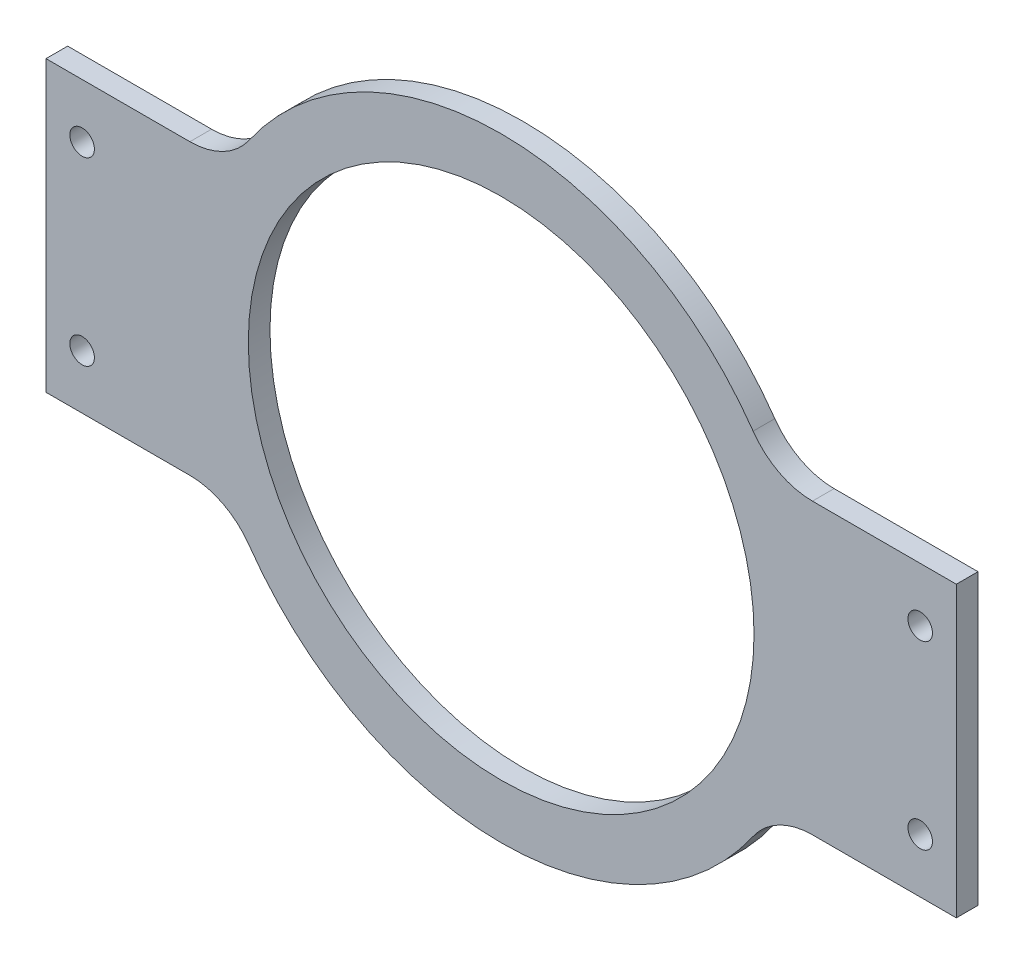
ISO-10303-21;
HEADER;
FILE_DESCRIPTION(('STEP AP214'),'2;1');
FILE_NAME('part.step','',(''),(''),'','','');
FILE_SCHEMA(('AUTOMOTIVE_DESIGN { 1 0 10303 214 1 1 1 1 }'));
ENDSEC;
DATA;
#1=APPLICATION_CONTEXT('core data for automotive mechanical design processes');
#2=APPLICATION_PROTOCOL_DEFINITION('international standard','automotive_design',2000,#1);
#3=PRODUCT_CONTEXT('',#1,'mechanical');
#4=PRODUCT('Part','Part','',(#3));
#5=PRODUCT_RELATED_PRODUCT_CATEGORY('part','',(#4));
#6=PRODUCT_DEFINITION_FORMATION('','',#4);
#7=PRODUCT_DEFINITION_CONTEXT('part definition',#1,'design');
#8=PRODUCT_DEFINITION('design','',#6,#7);
#9=PRODUCT_DEFINITION_SHAPE('','',#8);
#10=(LENGTH_UNIT() NAMED_UNIT(*) SI_UNIT(.MILLI.,.METRE.));
#11=(NAMED_UNIT(*) PLANE_ANGLE_UNIT() SI_UNIT($,.RADIAN.));
#12=(NAMED_UNIT(*) SI_UNIT($,.STERADIAN.) SOLID_ANGLE_UNIT());
#13=UNCERTAINTY_MEASURE_WITH_UNIT(LENGTH_MEASURE(1.E-05),#10,'distance_accuracy_value','');
#14=(GEOMETRIC_REPRESENTATION_CONTEXT(3) GLOBAL_UNCERTAINTY_ASSIGNED_CONTEXT((#13)) GLOBAL_UNIT_ASSIGNED_CONTEXT((#10,
#11,#12)) REPRESENTATION_CONTEXT('',''));
#15=CARTESIAN_POINT('',(0.,0.,0.));
#16=DIRECTION('',(0.,0.,1.));
#17=DIRECTION('',(1.,0.,0.));
#18=AXIS2_PLACEMENT_3D('',#15,#16,#17);
#19=CARTESIAN_POINT('',(0.,0.,1.5));
#20=DIRECTION('',(0.,0.,1.));
#21=DIRECTION('',(1.,0.,0.));
#22=AXIS2_PLACEMENT_3D('',#19,#20,#21);
#23=PLANE('',#22);
#24=CARTESIAN_POINT('',(58.,12.5,1.5));
#25=DIRECTION('',(0.,0.,1.));
#26=DIRECTION('',(1.,0.,0.));
#27=AXIS2_PLACEMENT_3D('',#24,#25,#26);
#28=CIRCLE('',#27,1.69999999999999);
#29=CARTESIAN_POINT('',(59.7,12.5,1.5));
#30=VERTEX_POINT('',#29);
#31=EDGE_CURVE('E326',#30,#30,#28,.T.);
#32=ORIENTED_EDGE('',*,*,#31,.F.);
#33=EDGE_LOOP('',(#32));
#34=FACE_BOUND('',#33,.T.);
#35=CARTESIAN_POINT('',(58.,-12.5,1.5));
#36=DIRECTION('',(0.,0.,1.));
#37=DIRECTION('',(1.,0.,0.));
#38=AXIS2_PLACEMENT_3D('',#35,#36,#37);
#39=CIRCLE('',#38,1.69999999999999);
#40=CARTESIAN_POINT('',(59.7,-12.5,1.5));
#41=VERTEX_POINT('',#40);
#42=EDGE_CURVE('E320',#41,#41,#39,.T.);
#43=ORIENTED_EDGE('',*,*,#42,.F.);
#44=EDGE_LOOP('',(#43));
#45=FACE_BOUND('',#44,.T.);
#46=CARTESIAN_POINT('',(-58.,12.5,1.5));
#47=DIRECTION('',(0.,0.,1.));
#48=DIRECTION('',(1.,0.,0.));
#49=AXIS2_PLACEMENT_3D('',#46,#47,#48);
#50=CIRCLE('',#49,1.69999999999999);
#51=CARTESIAN_POINT('',(-56.3,12.5,1.5));
#52=VERTEX_POINT('',#51);
#53=EDGE_CURVE('E314',#52,#52,#50,.T.);
#54=ORIENTED_EDGE('',*,*,#53,.F.);
#55=EDGE_LOOP('',(#54));
#56=FACE_BOUND('',#55,.T.);
#57=CARTESIAN_POINT('',(-58.,-12.5,1.5));
#58=DIRECTION('',(0.,0.,1.));
#59=DIRECTION('',(1.,0.,0.));
#60=AXIS2_PLACEMENT_3D('',#57,#58,#59);
#61=CIRCLE('',#60,1.69999999999999);
#62=CARTESIAN_POINT('',(-56.3,-12.5,1.5));
#63=VERTEX_POINT('',#62);
#64=EDGE_CURVE('E308',#63,#63,#61,.T.);
#65=ORIENTED_EDGE('',*,*,#64,.F.);
#66=EDGE_LOOP('',(#65));
#67=FACE_BOUND('',#66,.T.);
#68=DIRECTION('',(-1.,0.,0.));
#69=VECTOR('',#68,1.);
#70=CARTESIAN_POINT('',(37.5,20.,1.5));
#71=LINE('',#70,#69);
#72=CARTESIAN_POINT('',(63.,20.,1.5));
#73=VERTEX_POINT('',#72);
#74=CARTESIAN_POINT('',(43.0842198490352,20.,1.5));
#75=VERTEX_POINT('',#74);
#76=EDGE_CURVE('E158',#73,#75,#71,.T.);
#77=ORIENTED_EDGE('',*,*,#76,.T.);
#78=CARTESIAN_POINT('',(43.0842198490352,30.,1.5));
#79=DIRECTION('',(0.,0.,1.));
#80=DIRECTION('',(1.,0.,0.));
#81=AXIS2_PLACEMENT_3D('',#78,#79,#80);
#82=CIRCLE('',#81,10.);
#83=CARTESIAN_POINT('',(34.8777017825523,24.2857142857143,1.5));
#84=VERTEX_POINT('',#83);
#85=EDGE_CURVE('E215',#75,#84,#82,.F.);
#86=ORIENTED_EDGE('',*,*,#85,.T.);
#87=CARTESIAN_POINT('',(0.,0.,1.5));
#88=DIRECTION('',(0.,0.,1.));
#89=DIRECTION('',(1.,0.,0.));
#90=AXIS2_PLACEMENT_3D('',#87,#88,#89);
#91=CIRCLE('',#90,42.5);
#92=CARTESIAN_POINT('',(-34.8777017825523,24.2857142857143,1.5));
#93=VERTEX_POINT('',#92);
#94=EDGE_CURVE('E131',#84,#93,#91,.T.);
#95=ORIENTED_EDGE('',*,*,#94,.T.);
#96=CARTESIAN_POINT('',(-43.0842198490352,30.,1.5));
#97=DIRECTION('',(0.,0.,1.));
#98=DIRECTION('',(1.,0.,0.));
#99=AXIS2_PLACEMENT_3D('',#96,#97,#98);
#100=CIRCLE('',#99,10.);
#101=CARTESIAN_POINT('',(-43.0842198490352,20.,1.5));
#102=VERTEX_POINT('',#101);
#103=EDGE_CURVE('E11',#93,#102,#100,.F.);
#104=ORIENTED_EDGE('',*,*,#103,.T.);
#105=DIRECTION('',(-1.,0.,0.));
#106=VECTOR('',#105,1.);
#107=CARTESIAN_POINT('',(-63.,20.,1.5));
#108=LINE('',#107,#106);
#109=CARTESIAN_POINT('',(-63.,20.,1.5));
#110=VERTEX_POINT('',#109);
#111=EDGE_CURVE('E122',#102,#110,#108,.T.);
#112=ORIENTED_EDGE('',*,*,#111,.T.);
#113=DIRECTION('',(0.,-1.,0.));
#114=VECTOR('',#113,1.);
#115=CARTESIAN_POINT('',(-63.,20.,1.5));
#116=LINE('',#115,#114);
#117=CARTESIAN_POINT('',(-63.,-20.,1.5));
#118=VERTEX_POINT('',#117);
#119=EDGE_CURVE('E128',#110,#118,#116,.T.);
#120=ORIENTED_EDGE('',*,*,#119,.T.);
#121=DIRECTION('',(1.,0.,0.));
#122=VECTOR('',#121,1.);
#123=CARTESIAN_POINT('',(-63.,-20.,1.5));
#124=LINE('',#123,#122);
#125=CARTESIAN_POINT('',(-43.0842198490352,-20.,1.5));
#126=VERTEX_POINT('',#125);
#127=EDGE_CURVE('E146',#118,#126,#124,.T.);
#128=ORIENTED_EDGE('',*,*,#127,.T.);
#129=CARTESIAN_POINT('',(-43.0842198490352,-30.,1.5));
#130=DIRECTION('',(0.,0.,1.));
#131=DIRECTION('',(1.,0.,0.));
#132=AXIS2_PLACEMENT_3D('',#129,#130,#131);
#133=CIRCLE('',#132,10.);
#134=CARTESIAN_POINT('',(-34.8777017825523,-24.2857142857143,1.5));
#135=VERTEX_POINT('',#134);
#136=EDGE_CURVE('E207',#126,#135,#133,.F.);
#137=ORIENTED_EDGE('',*,*,#136,.T.);
#138=CARTESIAN_POINT('',(0.,0.,1.5));
#139=DIRECTION('',(0.,0.,1.));
#140=DIRECTION('',(1.,0.,0.));
#141=AXIS2_PLACEMENT_3D('',#138,#139,#140);
#142=CIRCLE('',#141,42.5);
#143=CARTESIAN_POINT('',(34.8777017825523,-24.2857142857143,1.5));
#144=VERTEX_POINT('',#143);
#145=EDGE_CURVE('E148',#135,#144,#142,.T.);
#146=ORIENTED_EDGE('',*,*,#145,.T.);
#147=CARTESIAN_POINT('',(43.0842198490352,-30.,1.5));
#148=DIRECTION('',(0.,0.,1.));
#149=DIRECTION('',(1.,0.,0.));
#150=AXIS2_PLACEMENT_3D('',#147,#148,#149);
#151=CIRCLE('',#150,10.);
#152=CARTESIAN_POINT('',(43.0842198490352,-20.,1.5));
#153=VERTEX_POINT('',#152);
#154=EDGE_CURVE('E211',#144,#153,#151,.F.);
#155=ORIENTED_EDGE('',*,*,#154,.T.);
#156=DIRECTION('',(1.,0.,0.));
#157=VECTOR('',#156,1.);
#158=CARTESIAN_POINT('',(37.5,-20.,1.5));
#159=LINE('',#158,#157);
#160=CARTESIAN_POINT('',(63.,-20.,1.5));
#161=VERTEX_POINT('',#160);
#162=EDGE_CURVE('E154',#153,#161,#159,.T.);
#163=ORIENTED_EDGE('',*,*,#162,.T.);
#164=DIRECTION('',(0.,1.,0.));
#165=VECTOR('',#164,1.);
#166=CARTESIAN_POINT('',(63.,20.,1.5));
#167=LINE('',#166,#165);
#168=EDGE_CURVE('E156',#161,#73,#167,.T.);
#169=ORIENTED_EDGE('',*,*,#168,.T.);
#170=EDGE_LOOP('',(#77,#86,#95,#104,#112,#120,#128,#137,#146,#155,#163,#169));
#171=FACE_BOUND('',#170,.T.);
#172=CARTESIAN_POINT('',(0.,0.,1.5));
#173=DIRECTION('',(0.,0.,1.));
#174=DIRECTION('',(1.,0.,0.));
#175=AXIS2_PLACEMENT_3D('',#172,#173,#174);
#176=CIRCLE('',#175,35.);
#177=CARTESIAN_POINT('',(35.,0.,1.5));
#178=VERTEX_POINT('',#177);
#179=EDGE_CURVE('E164',#178,#178,#176,.T.);
#180=ORIENTED_EDGE('',*,*,#179,.F.);
#181=EDGE_LOOP('',(#180));
#182=FACE_BOUND('',#181,.T.);
#183=ADVANCED_FACE('F37',(#34,#45,#56,#67,#171,#182),#23,.T.);
#184=CARTESIAN_POINT('',(0.,0.,-1.5));
#185=DIRECTION('',(0.,0.,1.));
#186=DIRECTION('',(1.,0.,0.));
#187=AXIS2_PLACEMENT_3D('',#184,#185,#186);
#188=PLANE('',#187);
#189=CARTESIAN_POINT('',(58.,12.5,-1.5));
#190=DIRECTION('',(0.,0.,1.));
#191=DIRECTION('',(1.,0.,0.));
#192=AXIS2_PLACEMENT_3D('',#189,#190,#191);
#193=CIRCLE('',#192,1.7);
#194=CARTESIAN_POINT('',(59.7,12.5,-1.5));
#195=VERTEX_POINT('',#194);
#196=EDGE_CURVE('E323',#195,#195,#193,.T.);
#197=ORIENTED_EDGE('',*,*,#196,.T.);
#198=EDGE_LOOP('',(#197));
#199=FACE_BOUND('',#198,.T.);
#200=CARTESIAN_POINT('',(58.,-12.5,-1.5));
#201=DIRECTION('',(0.,0.,1.));
#202=DIRECTION('',(1.,0.,0.));
#203=AXIS2_PLACEMENT_3D('',#200,#201,#202);
#204=CIRCLE('',#203,1.7);
#205=CARTESIAN_POINT('',(59.7,-12.5,-1.5));
#206=VERTEX_POINT('',#205);
#207=EDGE_CURVE('E317',#206,#206,#204,.T.);
#208=ORIENTED_EDGE('',*,*,#207,.T.);
#209=EDGE_LOOP('',(#208));
#210=FACE_BOUND('',#209,.T.);
#211=CARTESIAN_POINT('',(-58.,12.5,-1.5));
#212=DIRECTION('',(0.,0.,1.));
#213=DIRECTION('',(1.,0.,0.));
#214=AXIS2_PLACEMENT_3D('',#211,#212,#213);
#215=CIRCLE('',#214,1.7);
#216=CARTESIAN_POINT('',(-56.3,12.5,-1.5));
#217=VERTEX_POINT('',#216);
#218=EDGE_CURVE('E311',#217,#217,#215,.T.);
#219=ORIENTED_EDGE('',*,*,#218,.T.);
#220=EDGE_LOOP('',(#219));
#221=FACE_BOUND('',#220,.T.);
#222=CARTESIAN_POINT('',(-58.,-12.5,-1.5));
#223=DIRECTION('',(0.,0.,1.));
#224=DIRECTION('',(1.,0.,0.));
#225=AXIS2_PLACEMENT_3D('',#222,#223,#224);
#226=CIRCLE('',#225,1.7);
#227=CARTESIAN_POINT('',(-56.3,-12.5,-1.5));
#228=VERTEX_POINT('',#227);
#229=EDGE_CURVE('E303',#228,#228,#226,.T.);
#230=ORIENTED_EDGE('',*,*,#229,.T.);
#231=EDGE_LOOP('',(#230));
#232=FACE_BOUND('',#231,.T.);
#233=CARTESIAN_POINT('',(0.,0.,-1.5));
#234=DIRECTION('',(0.,0.,1.));
#235=DIRECTION('',(1.,0.,0.));
#236=AXIS2_PLACEMENT_3D('',#233,#234,#235);
#237=CIRCLE('',#236,42.5);
#238=CARTESIAN_POINT('',(34.8777017825523,24.2857142857143,-1.5));
#239=VERTEX_POINT('',#238);
#240=CARTESIAN_POINT('',(-34.8777017825523,24.2857142857143,-1.5));
#241=VERTEX_POINT('',#240);
#242=EDGE_CURVE('E161',#239,#241,#237,.T.);
#243=ORIENTED_EDGE('',*,*,#242,.F.);
#244=CARTESIAN_POINT('',(43.0842198490352,30.,-1.5));
#245=DIRECTION('',(0.,0.,1.));
#246=DIRECTION('',(1.,0.,0.));
#247=AXIS2_PLACEMENT_3D('',#244,#245,#246);
#248=CIRCLE('',#247,10.);
#249=CARTESIAN_POINT('',(43.0842198490352,20.,-1.5));
#250=VERTEX_POINT('',#249);
#251=EDGE_CURVE('E213',#239,#250,#248,.T.);
#252=ORIENTED_EDGE('',*,*,#251,.T.);
#253=DIRECTION('',(-1.,0.,0.));
#254=VECTOR('',#253,1.);
#255=CARTESIAN_POINT('',(37.5,20.,-1.5));
#256=LINE('',#255,#254);
#257=CARTESIAN_POINT('',(63.,20.,-1.5));
#258=VERTEX_POINT('',#257);
#259=EDGE_CURVE('E178',#258,#250,#256,.T.);
#260=ORIENTED_EDGE('',*,*,#259,.F.);
#261=DIRECTION('',(0.,1.,0.));
#262=VECTOR('',#261,1.);
#263=CARTESIAN_POINT('',(63.,20.,-1.5));
#264=LINE('',#263,#262);
#265=CARTESIAN_POINT('',(63.,-20.,-1.5));
#266=VERTEX_POINT('',#265);
#267=EDGE_CURVE('E176',#266,#258,#264,.T.);
#268=ORIENTED_EDGE('',*,*,#267,.F.);
#269=DIRECTION('',(1.,0.,0.));
#270=VECTOR('',#269,1.);
#271=CARTESIAN_POINT('',(37.5,-20.,-1.5));
#272=LINE('',#271,#270);
#273=CARTESIAN_POINT('',(43.0842198490352,-20.,-1.5));
#274=VERTEX_POINT('',#273);
#275=EDGE_CURVE('E174',#274,#266,#272,.T.);
#276=ORIENTED_EDGE('',*,*,#275,.F.);
#277=CARTESIAN_POINT('',(43.0842198490352,-30.,-1.5));
#278=DIRECTION('',(0.,0.,1.));
#279=DIRECTION('',(1.,0.,0.));
#280=AXIS2_PLACEMENT_3D('',#277,#278,#279);
#281=CIRCLE('',#280,10.);
#282=CARTESIAN_POINT('',(34.8777017825523,-24.2857142857143,-1.5));
#283=VERTEX_POINT('',#282);
#284=EDGE_CURVE('E209',#274,#283,#281,.T.);
#285=ORIENTED_EDGE('',*,*,#284,.T.);
#286=CARTESIAN_POINT('',(0.,0.,-1.5));
#287=DIRECTION('',(0.,0.,1.));
#288=DIRECTION('',(1.,0.,0.));
#289=AXIS2_PLACEMENT_3D('',#286,#287,#288);
#290=CIRCLE('',#289,42.5);
#291=CARTESIAN_POINT('',(-34.8777017825523,-24.2857142857143,-1.5));
#292=VERTEX_POINT('',#291);
#293=EDGE_CURVE('E171',#292,#283,#290,.T.);
#294=ORIENTED_EDGE('',*,*,#293,.F.);
#295=CARTESIAN_POINT('',(-43.0842198490352,-30.,-1.5));
#296=DIRECTION('',(0.,0.,1.));
#297=DIRECTION('',(1.,0.,0.));
#298=AXIS2_PLACEMENT_3D('',#295,#296,#297);
#299=CIRCLE('',#298,10.);
#300=CARTESIAN_POINT('',(-43.0842198490352,-20.,-1.5));
#301=VERTEX_POINT('',#300);
#302=EDGE_CURVE('E205',#292,#301,#299,.T.);
#303=ORIENTED_EDGE('',*,*,#302,.T.);
#304=DIRECTION('',(1.,0.,0.));
#305=VECTOR('',#304,1.);
#306=CARTESIAN_POINT('',(-63.,-20.,-1.5));
#307=LINE('',#306,#305);
#308=CARTESIAN_POINT('',(-63.,-20.,-1.5));
#309=VERTEX_POINT('',#308);
#310=EDGE_CURVE('E168',#309,#301,#307,.T.);
#311=ORIENTED_EDGE('',*,*,#310,.F.);
#312=DIRECTION('',(0.,-1.,0.));
#313=VECTOR('',#312,1.);
#314=CARTESIAN_POINT('',(-63.,20.,-1.5));
#315=LINE('',#314,#313);
#316=CARTESIAN_POINT('',(-63.,20.,-1.5));
#317=VERTEX_POINT('',#316);
#318=EDGE_CURVE('E166',#317,#309,#315,.T.);
#319=ORIENTED_EDGE('',*,*,#318,.F.);
#320=DIRECTION('',(-1.,0.,0.));
#321=VECTOR('',#320,1.);
#322=CARTESIAN_POINT('',(-63.,20.,-1.5));
#323=LINE('',#322,#321);
#324=CARTESIAN_POINT('',(-43.0842198490352,20.,-1.5));
#325=VERTEX_POINT('',#324);
#326=EDGE_CURVE('E137',#325,#317,#323,.T.);
#327=ORIENTED_EDGE('',*,*,#326,.F.);
#328=CARTESIAN_POINT('',(-43.0842198490352,30.,-1.5));
#329=DIRECTION('',(0.,0.,1.));
#330=DIRECTION('',(1.,0.,0.));
#331=AXIS2_PLACEMENT_3D('',#328,#329,#330);
#332=CIRCLE('',#331,10.);
#333=EDGE_CURVE('E45',#325,#241,#332,.T.);
#334=ORIENTED_EDGE('',*,*,#333,.T.);
#335=EDGE_LOOP('',(#243,#252,#260,#268,#276,#285,#294,#303,#311,#319,#327,#334));
#336=FACE_BOUND('',#335,.T.);
#337=CARTESIAN_POINT('',(0.,0.,-1.5));
#338=DIRECTION('',(0.,0.,1.));
#339=DIRECTION('',(1.,0.,0.));
#340=AXIS2_PLACEMENT_3D('',#337,#338,#339);
#341=CIRCLE('',#340,35.);
#342=CARTESIAN_POINT('',(35.,0.,-1.5));
#343=VERTEX_POINT('',#342);
#344=EDGE_CURVE('E300',#343,#343,#341,.T.);
#345=ORIENTED_EDGE('',*,*,#344,.T.);
#346=EDGE_LOOP('',(#345));
#347=FACE_BOUND('',#346,.T.);
#348=ADVANCED_FACE('F218',(#199,#210,#221,#232,#336,#347),#188,.F.);
#349=CARTESIAN_POINT('',(0.,0.,1.5));
#350=DIRECTION('',(0.,0.,-1.));
#351=DIRECTION('',(-1.,0.,0.));
#352=AXIS2_PLACEMENT_3D('',#349,#350,#351);
#353=CYLINDRICAL_SURFACE('',#352,42.5);
#354=ORIENTED_EDGE('',*,*,#94,.F.);
#355=DIRECTION('',(0.,0.,-1.));
#356=VECTOR('',#355,1.);
#357=CARTESIAN_POINT('',(34.8777017825523,24.2857142857143,1.5));
#358=LINE('',#357,#356);
#359=EDGE_CURVE('E198',#84,#239,#358,.T.);
#360=ORIENTED_EDGE('',*,*,#359,.T.);
#361=ORIENTED_EDGE('',*,*,#242,.T.);
#362=DIRECTION('',(0.,0.,-1.));
#363=VECTOR('',#362,1.);
#364=CARTESIAN_POINT('',(-34.8777017825523,24.2857142857143,1.5));
#365=LINE('',#364,#363);
#366=EDGE_CURVE('E196',#241,#93,#365,.F.);
#367=ORIENTED_EDGE('',*,*,#366,.T.);
#368=EDGE_LOOP('',(#354,#360,#361,#367));
#369=FACE_BOUND('',#368,.T.);
#370=ADVANCED_FACE('F222',(#369),#353,.T.);
#371=CARTESIAN_POINT('',(-63.,20.,1.5));
#372=DIRECTION('',(0.,-1.,0.));
#373=DIRECTION('',(0.,0.,-1.));
#374=AXIS2_PLACEMENT_3D('',#371,#372,#373);
#375=PLANE('',#374);
#376=ORIENTED_EDGE('',*,*,#111,.F.);
#377=DIRECTION('',(0.,0.,1.));
#378=VECTOR('',#377,1.);
#379=CARTESIAN_POINT('',(-43.0842198490352,20.,-1.5));
#380=LINE('',#379,#378);
#381=EDGE_CURVE('E203',#102,#325,#380,.F.);
#382=ORIENTED_EDGE('',*,*,#381,.T.);
#383=ORIENTED_EDGE('',*,*,#326,.T.);
#384=DIRECTION('',(0.,0.,-1.));
#385=VECTOR('',#384,1.);
#386=CARTESIAN_POINT('',(-63.,20.,1.5));
#387=LINE('',#386,#385);
#388=EDGE_CURVE('E134',#110,#317,#387,.T.);
#389=ORIENTED_EDGE('',*,*,#388,.F.);
#390=EDGE_LOOP('',(#376,#382,#383,#389));
#391=FACE_BOUND('',#390,.T.);
#392=ADVANCED_FACE('F135',(#391),#375,.F.);
#393=CARTESIAN_POINT('',(-63.,20.,1.5));
#394=DIRECTION('',(1.,0.,0.));
#395=DIRECTION('',(0.,0.,-1.));
#396=AXIS2_PLACEMENT_3D('',#393,#394,#395);
#397=PLANE('',#396);
#398=ORIENTED_EDGE('',*,*,#318,.T.);
#399=DIRECTION('',(0.,0.,-1.));
#400=VECTOR('',#399,1.);
#401=CARTESIAN_POINT('',(-63.,-20.,1.5));
#402=LINE('',#401,#400);
#403=EDGE_CURVE('E141',#118,#309,#402,.T.);
#404=ORIENTED_EDGE('',*,*,#403,.F.);
#405=ORIENTED_EDGE('',*,*,#119,.F.);
#406=ORIENTED_EDGE('',*,*,#388,.T.);
#407=EDGE_LOOP('',(#398,#404,#405,#406));
#408=FACE_BOUND('',#407,.T.);
#409=ADVANCED_FACE('F143',(#408),#397,.F.);
#410=CARTESIAN_POINT('',(-63.,-20.,1.5));
#411=DIRECTION('',(0.,1.,0.));
#412=DIRECTION('',(0.,0.,1.));
#413=AXIS2_PLACEMENT_3D('',#410,#411,#412);
#414=PLANE('',#413);
#415=ORIENTED_EDGE('',*,*,#310,.T.);
#416=DIRECTION('',(0.,0.,1.));
#417=VECTOR('',#416,1.);
#418=CARTESIAN_POINT('',(-43.0842198490352,-20.,1.5));
#419=LINE('',#418,#417);
#420=EDGE_CURVE('E191',#301,#126,#419,.T.);
#421=ORIENTED_EDGE('',*,*,#420,.T.);
#422=ORIENTED_EDGE('',*,*,#127,.F.);
#423=ORIENTED_EDGE('',*,*,#403,.T.);
#424=EDGE_LOOP('',(#415,#421,#422,#423));
#425=FACE_BOUND('',#424,.T.);
#426=ADVANCED_FACE('F260',(#425),#414,.F.);
#427=CARTESIAN_POINT('',(0.,0.,1.5));
#428=DIRECTION('',(0.,0.,-1.));
#429=DIRECTION('',(-1.,0.,0.));
#430=AXIS2_PLACEMENT_3D('',#427,#428,#429);
#431=CYLINDRICAL_SURFACE('',#430,42.5);
#432=ORIENTED_EDGE('',*,*,#145,.F.);
#433=DIRECTION('',(0.,0.,-1.));
#434=VECTOR('',#433,1.);
#435=CARTESIAN_POINT('',(-34.8777017825523,-24.2857142857143,1.5));
#436=LINE('',#435,#434);
#437=EDGE_CURVE('E188',#135,#292,#436,.T.);
#438=ORIENTED_EDGE('',*,*,#437,.T.);
#439=ORIENTED_EDGE('',*,*,#293,.T.);
#440=DIRECTION('',(0.,0.,-1.));
#441=VECTOR('',#440,1.);
#442=CARTESIAN_POINT('',(34.8777017825523,-24.2857142857143,1.5));
#443=LINE('',#442,#441);
#444=EDGE_CURVE('E140',#283,#144,#443,.F.);
#445=ORIENTED_EDGE('',*,*,#444,.T.);
#446=EDGE_LOOP('',(#432,#438,#439,#445));
#447=FACE_BOUND('',#446,.T.);
#448=ADVANCED_FACE('F256',(#447),#431,.T.);
#449=CARTESIAN_POINT('',(37.5,-20.,1.5));
#450=DIRECTION('',(0.,1.,0.));
#451=DIRECTION('',(0.,0.,1.));
#452=AXIS2_PLACEMENT_3D('',#449,#450,#451);
#453=PLANE('',#452);
#454=ORIENTED_EDGE('',*,*,#162,.F.);
#455=DIRECTION('',(0.,0.,1.));
#456=VECTOR('',#455,1.);
#457=CARTESIAN_POINT('',(43.0842198490352,-20.,-1.5));
#458=LINE('',#457,#456);
#459=EDGE_CURVE('E193',#153,#274,#458,.F.);
#460=ORIENTED_EDGE('',*,*,#459,.T.);
#461=ORIENTED_EDGE('',*,*,#275,.T.);
#462=DIRECTION('',(0.,0.,-1.));
#463=VECTOR('',#462,1.);
#464=CARTESIAN_POINT('',(63.,-20.,1.5));
#465=LINE('',#464,#463);
#466=EDGE_CURVE('E183',#161,#266,#465,.T.);
#467=ORIENTED_EDGE('',*,*,#466,.F.);
#468=EDGE_LOOP('',(#454,#460,#461,#467));
#469=FACE_BOUND('',#468,.T.);
#470=ADVANCED_FACE('F252',(#469),#453,.F.);
#471=CARTESIAN_POINT('',(63.,20.,1.5));
#472=DIRECTION('',(-1.,0.,0.));
#473=DIRECTION('',(0.,0.,1.));
#474=AXIS2_PLACEMENT_3D('',#471,#472,#473);
#475=PLANE('',#474);
#476=ORIENTED_EDGE('',*,*,#267,.T.);
#477=DIRECTION('',(0.,0.,-1.));
#478=VECTOR('',#477,1.);
#479=CARTESIAN_POINT('',(63.,20.,1.5));
#480=LINE('',#479,#478);
#481=EDGE_CURVE('E160',#73,#258,#480,.T.);
#482=ORIENTED_EDGE('',*,*,#481,.F.);
#483=ORIENTED_EDGE('',*,*,#168,.F.);
#484=ORIENTED_EDGE('',*,*,#466,.T.);
#485=EDGE_LOOP('',(#476,#482,#483,#484));
#486=FACE_BOUND('',#485,.T.);
#487=ADVANCED_FACE('F248',(#486),#475,.F.);
#488=CARTESIAN_POINT('',(37.5,20.,1.5));
#489=DIRECTION('',(0.,-1.,0.));
#490=DIRECTION('',(0.,0.,-1.));
#491=AXIS2_PLACEMENT_3D('',#488,#489,#490);
#492=PLANE('',#491);
#493=ORIENTED_EDGE('',*,*,#259,.T.);
#494=DIRECTION('',(0.,0.,1.));
#495=VECTOR('',#494,1.);
#496=CARTESIAN_POINT('',(43.0842198490352,20.,1.5));
#497=LINE('',#496,#495);
#498=EDGE_CURVE('E201',#250,#75,#497,.T.);
#499=ORIENTED_EDGE('',*,*,#498,.T.);
#500=ORIENTED_EDGE('',*,*,#76,.F.);
#501=ORIENTED_EDGE('',*,*,#481,.T.);
#502=EDGE_LOOP('',(#493,#499,#500,#501));
#503=FACE_BOUND('',#502,.T.);
#504=ADVANCED_FACE('F245',(#503),#492,.F.);
#505=CARTESIAN_POINT('',(0.,0.,1.5));
#506=DIRECTION('',(0.,0.,-1.));
#507=DIRECTION('',(-1.,0.,0.));
#508=AXIS2_PLACEMENT_3D('',#505,#506,#507);
#509=CYLINDRICAL_SURFACE('',#508,35.);
#510=ORIENTED_EDGE('',*,*,#179,.T.);
#511=EDGE_LOOP('',(#510));
#512=FACE_BOUND('',#511,.T.);
#513=ORIENTED_EDGE('',*,*,#344,.F.);
#514=EDGE_LOOP('',(#513));
#515=FACE_BOUND('',#514,.T.);
#516=ADVANCED_FACE('F242',(#512,#515),#509,.F.);
#517=CARTESIAN_POINT('',(-58.,-12.5,1.5));
#518=DIRECTION('',(0.,0.,1.));
#519=DIRECTION('',(1.,0.,0.));
#520=AXIS2_PLACEMENT_3D('',#517,#518,#519);
#521=CYLINDRICAL_SURFACE('',#520,1.69999999999999);
#522=ORIENTED_EDGE('',*,*,#229,.F.);
#523=EDGE_LOOP('',(#522));
#524=FACE_BOUND('',#523,.T.);
#525=ORIENTED_EDGE('',*,*,#64,.T.);
#526=EDGE_LOOP('',(#525));
#527=FACE_BOUND('',#526,.T.);
#528=ADVANCED_FACE('F342',(#524,#527),#521,.F.);
#529=CARTESIAN_POINT('',(-58.,12.5,1.5));
#530=DIRECTION('',(0.,0.,1.));
#531=DIRECTION('',(1.,0.,0.));
#532=AXIS2_PLACEMENT_3D('',#529,#530,#531);
#533=CYLINDRICAL_SURFACE('',#532,1.69999999999999);
#534=ORIENTED_EDGE('',*,*,#218,.F.);
#535=EDGE_LOOP('',(#534));
#536=FACE_BOUND('',#535,.T.);
#537=ORIENTED_EDGE('',*,*,#53,.T.);
#538=EDGE_LOOP('',(#537));
#539=FACE_BOUND('',#538,.T.);
#540=ADVANCED_FACE('F336',(#536,#539),#533,.F.);
#541=CARTESIAN_POINT('',(58.,-12.5,1.5));
#542=DIRECTION('',(0.,0.,1.));
#543=DIRECTION('',(1.,0.,0.));
#544=AXIS2_PLACEMENT_3D('',#541,#542,#543);
#545=CYLINDRICAL_SURFACE('',#544,1.69999999999999);
#546=ORIENTED_EDGE('',*,*,#207,.F.);
#547=EDGE_LOOP('',(#546));
#548=FACE_BOUND('',#547,.T.);
#549=ORIENTED_EDGE('',*,*,#42,.T.);
#550=EDGE_LOOP('',(#549));
#551=FACE_BOUND('',#550,.T.);
#552=ADVANCED_FACE('F330',(#548,#551),#545,.F.);
#553=CARTESIAN_POINT('',(58.,12.5,1.5));
#554=DIRECTION('',(0.,0.,1.));
#555=DIRECTION('',(1.,0.,0.));
#556=AXIS2_PLACEMENT_3D('',#553,#554,#555);
#557=CYLINDRICAL_SURFACE('',#556,1.69999999999999);
#558=ORIENTED_EDGE('',*,*,#196,.F.);
#559=EDGE_LOOP('',(#558));
#560=FACE_BOUND('',#559,.T.);
#561=ORIENTED_EDGE('',*,*,#31,.T.);
#562=EDGE_LOOP('',(#561));
#563=FACE_BOUND('',#562,.T.);
#564=ADVANCED_FACE('F274',(#560,#563),#557,.F.);
#565=CARTESIAN_POINT('',(-43.0842198490352,-30.,1.5));
#566=DIRECTION('',(0.,0.,-1.));
#567=DIRECTION('',(-1.,0.,0.));
#568=AXIS2_PLACEMENT_3D('',#565,#566,#567);
#569=CYLINDRICAL_SURFACE('',#568,10.);
#570=ORIENTED_EDGE('',*,*,#136,.F.);
#571=ORIENTED_EDGE('',*,*,#420,.F.);
#572=ORIENTED_EDGE('',*,*,#302,.F.);
#573=ORIENTED_EDGE('',*,*,#437,.F.);
#574=EDGE_LOOP('',(#570,#571,#572,#573));
#575=FACE_BOUND('',#574,.T.);
#576=ADVANCED_FACE('F271',(#575),#569,.F.);
#577=CARTESIAN_POINT('',(43.0842198490352,-30.,1.5));
#578=DIRECTION('',(0.,0.,-1.));
#579=DIRECTION('',(-1.,0.,0.));
#580=AXIS2_PLACEMENT_3D('',#577,#578,#579);
#581=CYLINDRICAL_SURFACE('',#580,10.);
#582=ORIENTED_EDGE('',*,*,#154,.F.);
#583=ORIENTED_EDGE('',*,*,#444,.F.);
#584=ORIENTED_EDGE('',*,*,#284,.F.);
#585=ORIENTED_EDGE('',*,*,#459,.F.);
#586=EDGE_LOOP('',(#582,#583,#584,#585));
#587=FACE_BOUND('',#586,.T.);
#588=ADVANCED_FACE('F229',(#587),#581,.F.);
#589=CARTESIAN_POINT('',(43.0842198490352,30.,1.5));
#590=DIRECTION('',(0.,0.,-1.));
#591=DIRECTION('',(-1.,0.,0.));
#592=AXIS2_PLACEMENT_3D('',#589,#590,#591);
#593=CYLINDRICAL_SURFACE('',#592,10.);
#594=ORIENTED_EDGE('',*,*,#85,.F.);
#595=ORIENTED_EDGE('',*,*,#498,.F.);
#596=ORIENTED_EDGE('',*,*,#251,.F.);
#597=ORIENTED_EDGE('',*,*,#359,.F.);
#598=EDGE_LOOP('',(#594,#595,#596,#597));
#599=FACE_BOUND('',#598,.T.);
#600=ADVANCED_FACE('F225',(#599),#593,.F.);
#601=CARTESIAN_POINT('',(-43.0842198490352,30.,1.5));
#602=DIRECTION('',(0.,0.,-1.));
#603=DIRECTION('',(-1.,0.,0.));
#604=AXIS2_PLACEMENT_3D('',#601,#602,#603);
#605=CYLINDRICAL_SURFACE('',#604,10.);
#606=ORIENTED_EDGE('',*,*,#103,.F.);
#607=ORIENTED_EDGE('',*,*,#366,.F.);
#608=ORIENTED_EDGE('',*,*,#333,.F.);
#609=ORIENTED_EDGE('',*,*,#381,.F.);
#610=EDGE_LOOP('',(#606,#607,#608,#609));
#611=FACE_BOUND('',#610,.T.);
#612=ADVANCED_FACE('F39',(#611),#605,.F.);
#613=CLOSED_SHELL('',(#183,#348,#370,#392,#409,#426,#448,#470,#487,#504,#516,#528,#540,#552,
#564,#576,#588,#600,#612));
#614=MANIFOLD_SOLID_BREP('B2',#613);
#615=ADVANCED_BREP_SHAPE_REPRESENTATION('',(#18,#614),#14);
#616=SHAPE_DEFINITION_REPRESENTATION(#9,#615);
ENDSEC;
END-ISO-10303-21;
